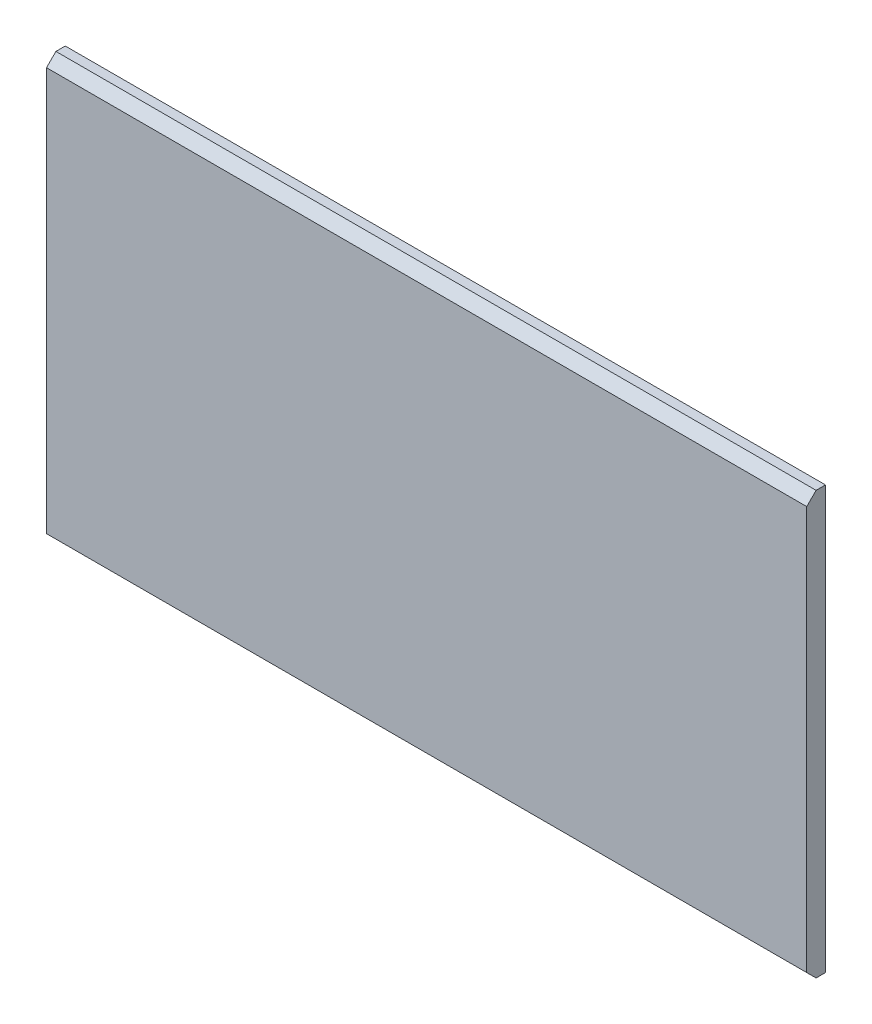
ISO-10303-21;
HEADER;
FILE_DESCRIPTION(('STEP AP214'),'2;1');
FILE_NAME('part.step','',(''),(''),'','','');
FILE_SCHEMA(('AUTOMOTIVE_DESIGN { 1 0 10303 214 1 1 1 1 }'));
ENDSEC;
DATA;
#1=APPLICATION_CONTEXT('core data for automotive mechanical design processes');
#2=APPLICATION_PROTOCOL_DEFINITION('international standard','automotive_design',2000,#1);
#3=PRODUCT_CONTEXT('',#1,'mechanical');
#4=PRODUCT('Part','Part','',(#3));
#5=PRODUCT_RELATED_PRODUCT_CATEGORY('part','',(#4));
#6=PRODUCT_DEFINITION_FORMATION('','',#4);
#7=PRODUCT_DEFINITION_CONTEXT('part definition',#1,'design');
#8=PRODUCT_DEFINITION('design','',#6,#7);
#9=PRODUCT_DEFINITION_SHAPE('','',#8);
#10=(LENGTH_UNIT() NAMED_UNIT(*) SI_UNIT(.MILLI.,.METRE.));
#11=(NAMED_UNIT(*) PLANE_ANGLE_UNIT() SI_UNIT($,.RADIAN.));
#12=(NAMED_UNIT(*) SI_UNIT($,.STERADIAN.) SOLID_ANGLE_UNIT());
#13=UNCERTAINTY_MEASURE_WITH_UNIT(LENGTH_MEASURE(1.E-05),#10,'distance_accuracy_value','');
#14=(GEOMETRIC_REPRESENTATION_CONTEXT(3) GLOBAL_UNCERTAINTY_ASSIGNED_CONTEXT((#13)) GLOBAL_UNIT_ASSIGNED_CONTEXT((#10,
#11,#12)) REPRESENTATION_CONTEXT('',''));
#15=CARTESIAN_POINT('',(0.,0.,0.));
#16=DIRECTION('',(0.,0.,1.));
#17=DIRECTION('',(1.,0.,0.));
#18=AXIS2_PLACEMENT_3D('',#15,#16,#17);
#19=CARTESIAN_POINT('',(202.5,112.5,10.));
#20=DIRECTION('',(-1.,0.,0.));
#21=DIRECTION('',(0.,0.,1.));
#22=AXIS2_PLACEMENT_3D('',#19,#20,#21);
#23=PLANE('',#22);
#24=DIRECTION('',(0.,1.,0.));
#25=VECTOR('',#24,1.);
#26=CARTESIAN_POINT('',(202.5,112.5,10.));
#27=LINE('',#26,#25);
#28=CARTESIAN_POINT('',(202.5,-107.5,10.));
#29=VERTEX_POINT('',#28);
#30=CARTESIAN_POINT('',(202.5,107.5,10.));
#31=VERTEX_POINT('',#30);
#32=EDGE_CURVE('E119',#29,#31,#27,.T.);
#33=ORIENTED_EDGE('',*,*,#32,.F.);
#34=DIRECTION('',(0.,-0.707106781186548,-0.707106781186548));
#35=VECTOR('',#34,1.);
#36=CARTESIAN_POINT('',(202.5,-107.5,10.));
#37=LINE('',#36,#35);
#38=CARTESIAN_POINT('',(202.5,-112.5,5.));
#39=VERTEX_POINT('',#38);
#40=EDGE_CURVE('E131',#29,#39,#37,.T.);
#41=ORIENTED_EDGE('',*,*,#40,.T.);
#42=DIRECTION('',(0.,0.,-1.));
#43=VECTOR('',#42,1.);
#44=CARTESIAN_POINT('',(202.5,-112.5,10.));
#45=LINE('',#44,#43);
#46=CARTESIAN_POINT('',(202.5,-112.5,0.));
#47=VERTEX_POINT('',#46);
#48=EDGE_CURVE('E109',#39,#47,#45,.T.);
#49=ORIENTED_EDGE('',*,*,#48,.T.);
#50=DIRECTION('',(0.,1.,0.));
#51=VECTOR('',#50,1.);
#52=CARTESIAN_POINT('',(202.5,112.5,0.));
#53=LINE('',#52,#51);
#54=CARTESIAN_POINT('',(202.5,112.5,0.));
#55=VERTEX_POINT('',#54);
#56=EDGE_CURVE('E104',#47,#55,#53,.T.);
#57=ORIENTED_EDGE('',*,*,#56,.T.);
#58=DIRECTION('',(0.,0.,-1.));
#59=VECTOR('',#58,1.);
#60=CARTESIAN_POINT('',(202.5,112.5,10.));
#61=LINE('',#60,#59);
#62=CARTESIAN_POINT('',(202.5,112.5,5.));
#63=VERTEX_POINT('',#62);
#64=EDGE_CURVE('E88',#63,#55,#61,.T.);
#65=ORIENTED_EDGE('',*,*,#64,.F.);
#66=DIRECTION('',(0.,-0.707106781186548,0.707106781186548));
#67=VECTOR('',#66,1.);
#68=CARTESIAN_POINT('',(202.5,107.5,10.));
#69=LINE('',#68,#67);
#70=EDGE_CURVE('E129',#63,#31,#69,.T.);
#71=ORIENTED_EDGE('',*,*,#70,.T.);
#72=EDGE_LOOP('',(#33,#41,#49,#57,#65,#71));
#73=FACE_BOUND('',#72,.T.);
#74=ADVANCED_FACE('F35',(#73),#23,.F.);
#75=CARTESIAN_POINT('',(-202.5,112.5,10.));
#76=DIRECTION('',(0.,-1.,0.));
#77=DIRECTION('',(0.,0.,-1.));
#78=AXIS2_PLACEMENT_3D('',#75,#76,#77);
#79=PLANE('',#78);
#80=DIRECTION('',(0.,0.,-1.));
#81=VECTOR('',#80,1.);
#82=CARTESIAN_POINT('',(-202.5,112.5,10.));
#83=LINE('',#82,#81);
#84=CARTESIAN_POINT('',(-202.5,112.5,5.));
#85=VERTEX_POINT('',#84);
#86=CARTESIAN_POINT('',(-202.5,112.5,0.));
#87=VERTEX_POINT('',#86);
#88=EDGE_CURVE('E98',#85,#87,#83,.T.);
#89=ORIENTED_EDGE('',*,*,#88,.F.);
#90=DIRECTION('',(1.,0.,0.));
#91=VECTOR('',#90,1.);
#92=CARTESIAN_POINT('',(202.5,112.5,5.));
#93=LINE('',#92,#91);
#94=EDGE_CURVE('E11',#85,#63,#93,.T.);
#95=ORIENTED_EDGE('',*,*,#94,.T.);
#96=ORIENTED_EDGE('',*,*,#64,.T.);
#97=DIRECTION('',(-1.,0.,0.));
#98=VECTOR('',#97,1.);
#99=CARTESIAN_POINT('',(-202.5,112.5,0.));
#100=LINE('',#99,#98);
#101=EDGE_CURVE('E91',#55,#87,#100,.T.);
#102=ORIENTED_EDGE('',*,*,#101,.T.);
#103=EDGE_LOOP('',(#89,#95,#96,#102));
#104=FACE_BOUND('',#103,.T.);
#105=ADVANCED_FACE('F90',(#104),#79,.F.);
#106=CARTESIAN_POINT('',(-202.5,112.5,10.));
#107=DIRECTION('',(1.,0.,0.));
#108=DIRECTION('',(0.,0.,-1.));
#109=AXIS2_PLACEMENT_3D('',#106,#107,#108);
#110=PLANE('',#109);
#111=DIRECTION('',(0.,0.,-1.));
#112=VECTOR('',#111,1.);
#113=CARTESIAN_POINT('',(-202.5,-112.5,10.));
#114=LINE('',#113,#112);
#115=CARTESIAN_POINT('',(-202.5,-112.5,5.));
#116=VERTEX_POINT('',#115);
#117=CARTESIAN_POINT('',(-202.5,-112.5,0.));
#118=VERTEX_POINT('',#117);
#119=EDGE_CURVE('E121',#116,#118,#114,.T.);
#120=ORIENTED_EDGE('',*,*,#119,.F.);
#121=DIRECTION('',(0.,0.707106781186548,0.707106781186548));
#122=VECTOR('',#121,1.);
#123=CARTESIAN_POINT('',(-202.5,-107.5,10.));
#124=LINE('',#123,#122);
#125=CARTESIAN_POINT('',(-202.5,-107.5,10.));
#126=VERTEX_POINT('',#125);
#127=EDGE_CURVE('E43',#116,#126,#124,.T.);
#128=ORIENTED_EDGE('',*,*,#127,.T.);
#129=DIRECTION('',(0.,-1.,0.));
#130=VECTOR('',#129,1.);
#131=CARTESIAN_POINT('',(-202.5,112.5,10.));
#132=LINE('',#131,#130);
#133=CARTESIAN_POINT('',(-202.5,107.5,10.));
#134=VERTEX_POINT('',#133);
#135=EDGE_CURVE('E113',#134,#126,#132,.T.);
#136=ORIENTED_EDGE('',*,*,#135,.F.);
#137=DIRECTION('',(0.,0.707106781186548,-0.707106781186548));
#138=VECTOR('',#137,1.);
#139=CARTESIAN_POINT('',(-202.5,107.5,10.));
#140=LINE('',#139,#138);
#141=EDGE_CURVE('E50',#134,#85,#140,.T.);
#142=ORIENTED_EDGE('',*,*,#141,.T.);
#143=ORIENTED_EDGE('',*,*,#88,.T.);
#144=DIRECTION('',(0.,-1.,0.));
#145=VECTOR('',#144,1.);
#146=CARTESIAN_POINT('',(-202.5,112.5,0.));
#147=LINE('',#146,#145);
#148=EDGE_CURVE('E106',#87,#118,#147,.T.);
#149=ORIENTED_EDGE('',*,*,#148,.T.);
#150=EDGE_LOOP('',(#120,#128,#136,#142,#143,#149));
#151=FACE_BOUND('',#150,.T.);
#152=ADVANCED_FACE('F136',(#151),#110,.F.);
#153=CARTESIAN_POINT('',(-202.5,-112.5,10.));
#154=DIRECTION('',(0.,1.,0.));
#155=DIRECTION('',(0.,0.,1.));
#156=AXIS2_PLACEMENT_3D('',#153,#154,#155);
#157=PLANE('',#156);
#158=ORIENTED_EDGE('',*,*,#48,.F.);
#159=DIRECTION('',(-1.,0.,0.));
#160=VECTOR('',#159,1.);
#161=CARTESIAN_POINT('',(-202.5,-112.5,5.));
#162=LINE('',#161,#160);
#163=EDGE_CURVE('E58',#39,#116,#162,.T.);
#164=ORIENTED_EDGE('',*,*,#163,.T.);
#165=ORIENTED_EDGE('',*,*,#119,.T.);
#166=DIRECTION('',(1.,0.,0.));
#167=VECTOR('',#166,1.);
#168=CARTESIAN_POINT('',(-202.5,-112.5,0.));
#169=LINE('',#168,#167);
#170=EDGE_CURVE('E117',#118,#47,#169,.T.);
#171=ORIENTED_EDGE('',*,*,#170,.T.);
#172=EDGE_LOOP('',(#158,#164,#165,#171));
#173=FACE_BOUND('',#172,.T.);
#174=ADVANCED_FACE('F144',(#173),#157,.F.);
#175=CARTESIAN_POINT('',(0.,0.,10.));
#176=DIRECTION('',(0.,0.,1.));
#177=DIRECTION('',(1.,0.,0.));
#178=AXIS2_PLACEMENT_3D('',#175,#176,#177);
#179=PLANE('',#178);
#180=ORIENTED_EDGE('',*,*,#135,.T.);
#181=DIRECTION('',(1.,0.,0.));
#182=VECTOR('',#181,1.);
#183=CARTESIAN_POINT('',(202.5,-107.5,10.));
#184=LINE('',#183,#182);
#185=EDGE_CURVE('E126',#126,#29,#184,.T.);
#186=ORIENTED_EDGE('',*,*,#185,.T.);
#187=ORIENTED_EDGE('',*,*,#32,.T.);
#188=DIRECTION('',(-1.,0.,0.));
#189=VECTOR('',#188,1.);
#190=CARTESIAN_POINT('',(-202.5,107.5,10.));
#191=LINE('',#190,#189);
#192=EDGE_CURVE('E97',#31,#134,#191,.T.);
#193=ORIENTED_EDGE('',*,*,#192,.T.);
#194=EDGE_LOOP('',(#180,#186,#187,#193));
#195=FACE_BOUND('',#194,.T.);
#196=ADVANCED_FACE('F140',(#195),#179,.T.);
#197=CARTESIAN_POINT('',(0.,0.,0.));
#198=DIRECTION('',(0.,0.,1.));
#199=DIRECTION('',(1.,0.,0.));
#200=AXIS2_PLACEMENT_3D('',#197,#198,#199);
#201=PLANE('',#200);
#202=ORIENTED_EDGE('',*,*,#56,.F.);
#203=ORIENTED_EDGE('',*,*,#170,.F.);
#204=ORIENTED_EDGE('',*,*,#148,.F.);
#205=ORIENTED_EDGE('',*,*,#101,.F.);
#206=EDGE_LOOP('',(#202,#203,#204,#205));
#207=FACE_BOUND('',#206,.T.);
#208=ADVANCED_FACE('F102',(#207),#201,.F.);
#209=CARTESIAN_POINT('',(0.,-107.5,10.));
#210=DIRECTION('',(0.,-0.707106781186547,0.707106781186547));
#211=DIRECTION('',(-1.,0.,0.));
#212=AXIS2_PLACEMENT_3D('',#209,#210,#211);
#213=PLANE('',#212);
#214=ORIENTED_EDGE('',*,*,#127,.F.);
#215=ORIENTED_EDGE('',*,*,#163,.F.);
#216=ORIENTED_EDGE('',*,*,#40,.F.);
#217=ORIENTED_EDGE('',*,*,#185,.F.);
#218=EDGE_LOOP('',(#214,#215,#216,#217));
#219=FACE_BOUND('',#218,.T.);
#220=ADVANCED_FACE('F143',(#219),#213,.T.);
#221=CARTESIAN_POINT('',(0.,107.5,10.));
#222=DIRECTION('',(0.,0.707106781186547,0.707106781186547));
#223=DIRECTION('',(1.,0.,0.));
#224=AXIS2_PLACEMENT_3D('',#221,#222,#223);
#225=PLANE('',#224);
#226=ORIENTED_EDGE('',*,*,#70,.F.);
#227=ORIENTED_EDGE('',*,*,#94,.F.);
#228=ORIENTED_EDGE('',*,*,#141,.F.);
#229=ORIENTED_EDGE('',*,*,#192,.F.);
#230=EDGE_LOOP('',(#226,#227,#228,#229));
#231=FACE_BOUND('',#230,.T.);
#232=ADVANCED_FACE('F37',(#231),#225,.T.);
#233=CLOSED_SHELL('',(#74,#105,#152,#174,#196,#208,#220,#232));
#234=MANIFOLD_SOLID_BREP('B2',#233);
#235=ADVANCED_BREP_SHAPE_REPRESENTATION('',(#18,#234),#14);
#236=SHAPE_DEFINITION_REPRESENTATION(#9,#235);
ENDSEC;
END-ISO-10303-21;
